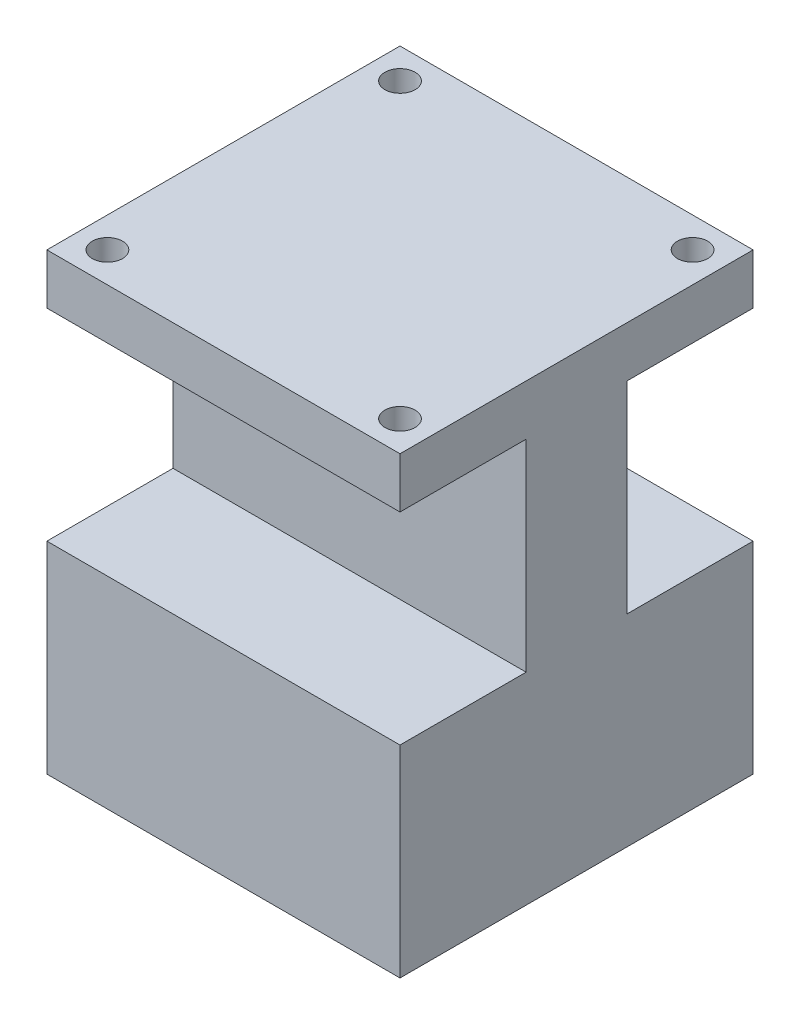
ISO-10303-21;
HEADER;
FILE_DESCRIPTION(('STEP AP214'),'2;1');
FILE_NAME('part.step','',(''),(''),'','','');
FILE_SCHEMA(('AUTOMOTIVE_DESIGN { 1 0 10303 214 1 1 1 1 }'));
ENDSEC;
DATA;
#1=APPLICATION_CONTEXT('core data for automotive mechanical design processes');
#2=APPLICATION_PROTOCOL_DEFINITION('international standard','automotive_design',2000,#1);
#3=PRODUCT_CONTEXT('',#1,'mechanical');
#4=PRODUCT('Part','Part','',(#3));
#5=PRODUCT_RELATED_PRODUCT_CATEGORY('part','',(#4));
#6=PRODUCT_DEFINITION_FORMATION('','',#4);
#7=PRODUCT_DEFINITION_CONTEXT('part definition',#1,'design');
#8=PRODUCT_DEFINITION('design','',#6,#7);
#9=PRODUCT_DEFINITION_SHAPE('','',#8);
#10=(LENGTH_UNIT() NAMED_UNIT(*) SI_UNIT(.MILLI.,.METRE.));
#11=(NAMED_UNIT(*) PLANE_ANGLE_UNIT() SI_UNIT($,.RADIAN.));
#12=(NAMED_UNIT(*) SI_UNIT($,.STERADIAN.) SOLID_ANGLE_UNIT());
#13=UNCERTAINTY_MEASURE_WITH_UNIT(LENGTH_MEASURE(1.E-05),#10,'distance_accuracy_value','');
#14=(GEOMETRIC_REPRESENTATION_CONTEXT(3) GLOBAL_UNCERTAINTY_ASSIGNED_CONTEXT((#13)) GLOBAL_UNIT_ASSIGNED_CONTEXT((#10,
#11,#12)) REPRESENTATION_CONTEXT('',''));
#15=CARTESIAN_POINT('',(0.,0.,0.));
#16=DIRECTION('',(0.,0.,1.));
#17=DIRECTION('',(1.,0.,0.));
#18=AXIS2_PLACEMENT_3D('',#15,#16,#17);
#19=CARTESIAN_POINT('',(0.,20.,0.));
#20=DIRECTION('',(0.,1.,0.));
#21=DIRECTION('',(0.,0.,1.));
#22=AXIS2_PLACEMENT_3D('',#19,#20,#21);
#23=PLANE('',#22);
#24=DIRECTION('',(1.,0.,0.));
#25=VECTOR('',#24,1.);
#26=CARTESIAN_POINT('',(-17.5,20.,5.));
#27=LINE('',#26,#25);
#28=CARTESIAN_POINT('',(-17.5,20.,5.));
#29=VERTEX_POINT('',#28);
#30=CARTESIAN_POINT('',(17.5,20.,5.));
#31=VERTEX_POINT('',#30);
#32=EDGE_CURVE('E62',#29,#31,#27,.T.);
#33=ORIENTED_EDGE('',*,*,#32,.F.);
#34=DIRECTION('',(0.,0.,1.));
#35=VECTOR('',#34,1.);
#36=CARTESIAN_POINT('',(-17.5,20.,-17.5));
#37=LINE('',#36,#35);
#38=CARTESIAN_POINT('',(-17.5,20.,17.5));
#39=VERTEX_POINT('',#38);
#40=EDGE_CURVE('E202',#29,#39,#37,.T.);
#41=ORIENTED_EDGE('',*,*,#40,.T.);
#42=DIRECTION('',(1.,0.,0.));
#43=VECTOR('',#42,1.);
#44=CARTESIAN_POINT('',(-17.5,20.,17.5));
#45=LINE('',#44,#43);
#46=CARTESIAN_POINT('',(17.5,20.,17.5));
#47=VERTEX_POINT('',#46);
#48=EDGE_CURVE('E207',#39,#47,#45,.T.);
#49=ORIENTED_EDGE('',*,*,#48,.T.);
#50=DIRECTION('',(0.,0.,-1.));
#51=VECTOR('',#50,1.);
#52=CARTESIAN_POINT('',(17.5,20.,-17.5));
#53=LINE('',#52,#51);
#54=EDGE_CURVE('E196',#47,#31,#53,.T.);
#55=ORIENTED_EDGE('',*,*,#54,.T.);
#56=EDGE_LOOP('',(#33,#41,#49,#55));
#57=FACE_BOUND('',#56,.T.);
#58=ADVANCED_FACE('F44',(#57),#23,.T.);
#59=CARTESIAN_POINT('',(17.5,20.,-17.5));
#60=DIRECTION('',(-1.,0.,0.));
#61=DIRECTION('',(0.,0.,1.));
#62=AXIS2_PLACEMENT_3D('',#59,#60,#61);
#63=PLANE('',#62);
#64=DIRECTION('',(0.,0.,-1.));
#65=VECTOR('',#64,1.);
#66=CARTESIAN_POINT('',(17.5,0.,-17.5));
#67=LINE('',#66,#65);
#68=CARTESIAN_POINT('',(17.5,0.,17.5));
#69=VERTEX_POINT('',#68);
#70=CARTESIAN_POINT('',(17.5,0.,-17.5));
#71=VERTEX_POINT('',#70);
#72=EDGE_CURVE('E197',#69,#71,#67,.T.);
#73=ORIENTED_EDGE('',*,*,#72,.T.);
#74=DIRECTION('',(0.,-1.,0.));
#75=VECTOR('',#74,1.);
#76=CARTESIAN_POINT('',(17.5,20.,-17.5));
#77=LINE('',#76,#75);
#78=CARTESIAN_POINT('',(17.5,20.,-17.5));
#79=VERTEX_POINT('',#78);
#80=EDGE_CURVE('E11',#79,#71,#77,.T.);
#81=ORIENTED_EDGE('',*,*,#80,.F.);
#82=CARTESIAN_POINT('',(17.5,20.,-5.));
#83=VERTEX_POINT('',#82);
#84=EDGE_CURVE('E205',#83,#79,#53,.T.);
#85=ORIENTED_EDGE('',*,*,#84,.F.);
#86=DIRECTION('',(0.,-1.,0.));
#87=VECTOR('',#86,1.);
#88=CARTESIAN_POINT('',(17.5,40.,-5.));
#89=LINE('',#88,#87);
#90=CARTESIAN_POINT('',(17.5,40.,-5.));
#91=VERTEX_POINT('',#90);
#92=EDGE_CURVE('E195',#91,#83,#89,.T.);
#93=ORIENTED_EDGE('',*,*,#92,.F.);
#94=DIRECTION('',(0.,0.,-1.));
#95=VECTOR('',#94,1.);
#96=CARTESIAN_POINT('',(17.5,40.,-17.5));
#97=LINE('',#96,#95);
#98=CARTESIAN_POINT('',(17.5,40.,-17.5));
#99=VERTEX_POINT('',#98);
#100=EDGE_CURVE('E460',#91,#99,#97,.T.);
#101=ORIENTED_EDGE('',*,*,#100,.T.);
#102=DIRECTION('',(0.,-1.,0.));
#103=VECTOR('',#102,1.);
#104=CARTESIAN_POINT('',(17.5,45.,-17.5));
#105=LINE('',#104,#103);
#106=CARTESIAN_POINT('',(17.5,45.,-17.5));
#107=VERTEX_POINT('',#106);
#108=EDGE_CURVE('E170',#107,#99,#105,.T.);
#109=ORIENTED_EDGE('',*,*,#108,.F.);
#110=DIRECTION('',(0.,0.,-1.));
#111=VECTOR('',#110,1.);
#112=CARTESIAN_POINT('',(17.5,45.,-17.5));
#113=LINE('',#112,#111);
#114=CARTESIAN_POINT('',(17.5,45.,17.5));
#115=VERTEX_POINT('',#114);
#116=EDGE_CURVE('E144',#115,#107,#113,.T.);
#117=ORIENTED_EDGE('',*,*,#116,.F.);
#118=DIRECTION('',(0.,-1.,0.));
#119=VECTOR('',#118,1.);
#120=CARTESIAN_POINT('',(17.5,45.,17.5));
#121=LINE('',#120,#119);
#122=CARTESIAN_POINT('',(17.5,40.,17.5));
#123=VERTEX_POINT('',#122);
#124=EDGE_CURVE('E143',#115,#123,#121,.T.);
#125=ORIENTED_EDGE('',*,*,#124,.T.);
#126=CARTESIAN_POINT('',(17.5,40.,5.));
#127=VERTEX_POINT('',#126);
#128=EDGE_CURVE('E456',#123,#127,#97,.T.);
#129=ORIENTED_EDGE('',*,*,#128,.T.);
#130=DIRECTION('',(0.,-1.,0.));
#131=VECTOR('',#130,1.);
#132=CARTESIAN_POINT('',(17.5,40.,5.));
#133=LINE('',#132,#131);
#134=EDGE_CURVE('E180',#127,#31,#133,.T.);
#135=ORIENTED_EDGE('',*,*,#134,.T.);
#136=ORIENTED_EDGE('',*,*,#54,.F.);
#137=DIRECTION('',(0.,-1.,0.));
#138=VECTOR('',#137,1.);
#139=CARTESIAN_POINT('',(17.5,20.,17.5));
#140=LINE('',#139,#138);
#141=EDGE_CURVE('E215',#47,#69,#140,.T.);
#142=ORIENTED_EDGE('',*,*,#141,.T.);
#143=EDGE_LOOP('',(#73,#81,#85,#93,#101,#109,#117,#125,#129,#135,#136,#142));
#144=FACE_BOUND('',#143,.T.);
#145=ADVANCED_FACE('F50',(#144),#63,.F.);
#146=CARTESIAN_POINT('',(-17.5,20.,-17.5));
#147=DIRECTION('',(0.,0.,1.));
#148=DIRECTION('',(1.,0.,0.));
#149=AXIS2_PLACEMENT_3D('',#146,#147,#148);
#150=PLANE('',#149);
#151=DIRECTION('',(-1.,0.,0.));
#152=VECTOR('',#151,1.);
#153=CARTESIAN_POINT('',(-17.5,0.,-17.5));
#154=LINE('',#153,#152);
#155=CARTESIAN_POINT('',(-17.5,0.,-17.5));
#156=VERTEX_POINT('',#155);
#157=EDGE_CURVE('E216',#71,#156,#154,.T.);
#158=ORIENTED_EDGE('',*,*,#157,.T.);
#159=DIRECTION('',(0.,-1.,0.));
#160=VECTOR('',#159,1.);
#161=CARTESIAN_POINT('',(-17.5,20.,-17.5));
#162=LINE('',#161,#160);
#163=CARTESIAN_POINT('',(-17.5,20.,-17.5));
#164=VERTEX_POINT('',#163);
#165=EDGE_CURVE('E53',#164,#156,#162,.T.);
#166=ORIENTED_EDGE('',*,*,#165,.F.);
#167=DIRECTION('',(-1.,0.,0.));
#168=VECTOR('',#167,1.);
#169=CARTESIAN_POINT('',(-17.5,20.,-17.5));
#170=LINE('',#169,#168);
#171=EDGE_CURVE('E203',#79,#164,#170,.T.);
#172=ORIENTED_EDGE('',*,*,#171,.F.);
#173=ORIENTED_EDGE('',*,*,#80,.T.);
#174=EDGE_LOOP('',(#158,#166,#172,#173));
#175=FACE_BOUND('',#174,.T.);
#176=ADVANCED_FACE('F256',(#175),#150,.F.);
#177=CARTESIAN_POINT('',(-17.5,20.,-17.5));
#178=DIRECTION('',(1.,0.,0.));
#179=DIRECTION('',(0.,0.,-1.));
#180=AXIS2_PLACEMENT_3D('',#177,#178,#179);
#181=PLANE('',#180);
#182=DIRECTION('',(0.,0.,1.));
#183=VECTOR('',#182,1.);
#184=CARTESIAN_POINT('',(-17.5,0.,-17.5));
#185=LINE('',#184,#183);
#186=CARTESIAN_POINT('',(-17.5,0.,17.5));
#187=VERTEX_POINT('',#186);
#188=EDGE_CURVE('E218',#156,#187,#185,.T.);
#189=ORIENTED_EDGE('',*,*,#188,.T.);
#190=DIRECTION('',(0.,-1.,0.));
#191=VECTOR('',#190,1.);
#192=CARTESIAN_POINT('',(-17.5,20.,17.5));
#193=LINE('',#192,#191);
#194=EDGE_CURVE('E229',#39,#187,#193,.T.);
#195=ORIENTED_EDGE('',*,*,#194,.F.);
#196=ORIENTED_EDGE('',*,*,#40,.F.);
#197=DIRECTION('',(0.,-1.,0.));
#198=VECTOR('',#197,1.);
#199=CARTESIAN_POINT('',(-17.5,40.,5.));
#200=LINE('',#199,#198);
#201=CARTESIAN_POINT('',(-17.5,40.,5.));
#202=VERTEX_POINT('',#201);
#203=EDGE_CURVE('E183',#202,#29,#200,.T.);
#204=ORIENTED_EDGE('',*,*,#203,.F.);
#205=DIRECTION('',(0.,0.,1.));
#206=VECTOR('',#205,1.);
#207=CARTESIAN_POINT('',(-17.5,40.,-17.5));
#208=LINE('',#207,#206);
#209=CARTESIAN_POINT('',(-17.5,40.,17.5));
#210=VERTEX_POINT('',#209);
#211=EDGE_CURVE('E159',#202,#210,#208,.T.);
#212=ORIENTED_EDGE('',*,*,#211,.T.);
#213=DIRECTION('',(0.,-1.,0.));
#214=VECTOR('',#213,1.);
#215=CARTESIAN_POINT('',(-17.5,45.,17.5));
#216=LINE('',#215,#214);
#217=CARTESIAN_POINT('',(-17.5,45.,17.5));
#218=VERTEX_POINT('',#217);
#219=EDGE_CURVE('E136',#218,#210,#216,.T.);
#220=ORIENTED_EDGE('',*,*,#219,.F.);
#221=DIRECTION('',(0.,0.,1.));
#222=VECTOR('',#221,1.);
#223=CARTESIAN_POINT('',(-17.5,45.,-17.5));
#224=LINE('',#223,#222);
#225=CARTESIAN_POINT('',(-17.5,45.,-17.5));
#226=VERTEX_POINT('',#225);
#227=EDGE_CURVE('E148',#226,#218,#224,.T.);
#228=ORIENTED_EDGE('',*,*,#227,.F.);
#229=DIRECTION('',(0.,-1.,0.));
#230=VECTOR('',#229,1.);
#231=CARTESIAN_POINT('',(-17.5,45.,-17.5));
#232=LINE('',#231,#230);
#233=CARTESIAN_POINT('',(-17.5,40.,-17.5));
#234=VERTEX_POINT('',#233);
#235=EDGE_CURVE('E446',#226,#234,#232,.T.);
#236=ORIENTED_EDGE('',*,*,#235,.T.);
#237=CARTESIAN_POINT('',(-17.5,40.,-5.));
#238=VERTEX_POINT('',#237);
#239=EDGE_CURVE('E448',#234,#238,#208,.T.);
#240=ORIENTED_EDGE('',*,*,#239,.T.);
#241=DIRECTION('',(0.,-1.,0.));
#242=VECTOR('',#241,1.);
#243=CARTESIAN_POINT('',(-17.5,40.,-5.));
#244=LINE('',#243,#242);
#245=CARTESIAN_POINT('',(-17.5,20.,-5.));
#246=VERTEX_POINT('',#245);
#247=EDGE_CURVE('E186',#238,#246,#244,.T.);
#248=ORIENTED_EDGE('',*,*,#247,.T.);
#249=EDGE_CURVE('E206',#164,#246,#37,.T.);
#250=ORIENTED_EDGE('',*,*,#249,.F.);
#251=ORIENTED_EDGE('',*,*,#165,.T.);
#252=EDGE_LOOP('',(#189,#195,#196,#204,#212,#220,#228,#236,#240,#248,#250,#251));
#253=FACE_BOUND('',#252,.T.);
#254=ADVANCED_FACE('F158',(#253),#181,.F.);
#255=CARTESIAN_POINT('',(-17.5,20.,17.5));
#256=DIRECTION('',(0.,0.,-1.));
#257=DIRECTION('',(-1.,0.,0.));
#258=AXIS2_PLACEMENT_3D('',#255,#256,#257);
#259=PLANE('',#258);
#260=DIRECTION('',(1.,0.,0.));
#261=VECTOR('',#260,1.);
#262=CARTESIAN_POINT('',(-17.5,0.,17.5));
#263=LINE('',#262,#261);
#264=EDGE_CURVE('E225',#187,#69,#263,.T.);
#265=ORIENTED_EDGE('',*,*,#264,.T.);
#266=ORIENTED_EDGE('',*,*,#141,.F.);
#267=ORIENTED_EDGE('',*,*,#48,.F.);
#268=ORIENTED_EDGE('',*,*,#194,.T.);
#269=EDGE_LOOP('',(#265,#266,#267,#268));
#270=FACE_BOUND('',#269,.T.);
#271=ADVANCED_FACE('F243',(#270),#259,.F.);
#272=DIRECTION('',(-1.,0.,0.));
#273=VECTOR('',#272,1.);
#274=CARTESIAN_POINT('',(-17.5,20.,-5.));
#275=LINE('',#274,#273);
#276=EDGE_CURVE('E66',#83,#246,#275,.T.);
#277=ORIENTED_EDGE('',*,*,#276,.F.);
#278=ORIENTED_EDGE('',*,*,#84,.T.);
#279=ORIENTED_EDGE('',*,*,#171,.T.);
#280=ORIENTED_EDGE('',*,*,#249,.T.);
#281=EDGE_LOOP('',(#277,#278,#279,#280));
#282=FACE_BOUND('',#281,.T.);
#283=ADVANCED_FACE('F258',(#282),#23,.T.);
#284=CARTESIAN_POINT('',(0.,0.,0.));
#285=DIRECTION('',(0.,1.,0.));
#286=DIRECTION('',(0.,0.,1.));
#287=AXIS2_PLACEMENT_3D('',#284,#285,#286);
#288=PLANE('',#287);
#289=ORIENTED_EDGE('',*,*,#72,.F.);
#290=ORIENTED_EDGE('',*,*,#264,.F.);
#291=ORIENTED_EDGE('',*,*,#188,.F.);
#292=ORIENTED_EDGE('',*,*,#157,.F.);
#293=EDGE_LOOP('',(#289,#290,#291,#292));
#294=FACE_BOUND('',#293,.T.);
#295=ADVANCED_FACE('F245',(#294),#288,.F.);
#296=CARTESIAN_POINT('',(-17.5,40.,-5.));
#297=DIRECTION('',(0.,0.,1.));
#298=DIRECTION('',(1.,0.,0.));
#299=AXIS2_PLACEMENT_3D('',#296,#297,#298);
#300=PLANE('',#299);
#301=ORIENTED_EDGE('',*,*,#276,.T.);
#302=ORIENTED_EDGE('',*,*,#247,.F.);
#303=DIRECTION('',(-1.,0.,0.));
#304=VECTOR('',#303,1.);
#305=CARTESIAN_POINT('',(-17.5,40.,-5.));
#306=LINE('',#305,#304);
#307=EDGE_CURVE('E172',#91,#238,#306,.T.);
#308=ORIENTED_EDGE('',*,*,#307,.F.);
#309=ORIENTED_EDGE('',*,*,#92,.T.);
#310=EDGE_LOOP('',(#301,#302,#308,#309));
#311=FACE_BOUND('',#310,.T.);
#312=ADVANCED_FACE('F277',(#311),#300,.F.);
#313=CARTESIAN_POINT('',(-17.5,40.,5.));
#314=DIRECTION('',(0.,0.,-1.));
#315=DIRECTION('',(-1.,0.,0.));
#316=AXIS2_PLACEMENT_3D('',#313,#314,#315);
#317=PLANE('',#316);
#318=ORIENTED_EDGE('',*,*,#32,.T.);
#319=ORIENTED_EDGE('',*,*,#134,.F.);
#320=DIRECTION('',(1.,0.,0.));
#321=VECTOR('',#320,1.);
#322=CARTESIAN_POINT('',(-17.5,40.,5.));
#323=LINE('',#322,#321);
#324=EDGE_CURVE('E173',#202,#127,#323,.T.);
#325=ORIENTED_EDGE('',*,*,#324,.F.);
#326=ORIENTED_EDGE('',*,*,#203,.T.);
#327=EDGE_LOOP('',(#318,#319,#325,#326));
#328=FACE_BOUND('',#327,.T.);
#329=ADVANCED_FACE('F252',(#328),#317,.F.);
#330=CARTESIAN_POINT('',(0.,40.,0.));
#331=DIRECTION('',(0.,1.,0.));
#332=DIRECTION('',(0.,0.,1.));
#333=AXIS2_PLACEMENT_3D('',#330,#331,#332);
#334=PLANE('',#333);
#335=CARTESIAN_POINT('',(14.5,40.,-14.5));
#336=DIRECTION('',(0.,1.,0.));
#337=DIRECTION('',(0.,0.,1.));
#338=AXIS2_PLACEMENT_3D('',#335,#336,#337);
#339=CIRCLE('',#338,1.5);
#340=CARTESIAN_POINT('',(14.5,40.,-13.));
#341=VERTEX_POINT('',#340);
#342=EDGE_CURVE('E442',#341,#341,#339,.F.);
#343=ORIENTED_EDGE('',*,*,#342,.F.);
#344=EDGE_LOOP('',(#343));
#345=FACE_BOUND('',#344,.T.);
#346=CARTESIAN_POINT('',(-14.5,40.,-14.5));
#347=DIRECTION('',(0.,1.,0.));
#348=DIRECTION('',(0.,0.,1.));
#349=AXIS2_PLACEMENT_3D('',#346,#347,#348);
#350=CIRCLE('',#349,1.5);
#351=CARTESIAN_POINT('',(-14.5,40.,-13.));
#352=VERTEX_POINT('',#351);
#353=EDGE_CURVE('E436',#352,#352,#350,.F.);
#354=ORIENTED_EDGE('',*,*,#353,.F.);
#355=EDGE_LOOP('',(#354));
#356=FACE_BOUND('',#355,.T.);
#357=ORIENTED_EDGE('',*,*,#100,.F.);
#358=ORIENTED_EDGE('',*,*,#307,.T.);
#359=ORIENTED_EDGE('',*,*,#239,.F.);
#360=DIRECTION('',(-1.,0.,0.));
#361=VECTOR('',#360,1.);
#362=CARTESIAN_POINT('',(-17.5,40.,-17.5));
#363=LINE('',#362,#361);
#364=EDGE_CURVE('E156',#99,#234,#363,.T.);
#365=ORIENTED_EDGE('',*,*,#364,.F.);
#366=EDGE_LOOP('',(#357,#358,#359,#365));
#367=FACE_BOUND('',#366,.T.);
#368=ADVANCED_FACE('F329',(#345,#356,#367),#334,.F.);
#369=CARTESIAN_POINT('',(-14.5,40.,14.5));
#370=DIRECTION('',(0.,1.,0.));
#371=DIRECTION('',(0.,0.,1.));
#372=AXIS2_PLACEMENT_3D('',#369,#370,#371);
#373=CIRCLE('',#372,1.5);
#374=CARTESIAN_POINT('',(-14.5,40.,16.));
#375=VERTEX_POINT('',#374);
#376=EDGE_CURVE('E424',#375,#375,#373,.F.);
#377=ORIENTED_EDGE('',*,*,#376,.F.);
#378=EDGE_LOOP('',(#377));
#379=FACE_BOUND('',#378,.T.);
#380=CARTESIAN_POINT('',(14.5,40.,14.5));
#381=DIRECTION('',(0.,1.,0.));
#382=DIRECTION('',(0.,0.,1.));
#383=AXIS2_PLACEMENT_3D('',#380,#381,#382);
#384=CIRCLE('',#383,1.5);
#385=CARTESIAN_POINT('',(14.5,40.,16.));
#386=VERTEX_POINT('',#385);
#387=EDGE_CURVE('E431',#386,#386,#384,.F.);
#388=ORIENTED_EDGE('',*,*,#387,.F.);
#389=EDGE_LOOP('',(#388));
#390=FACE_BOUND('',#389,.T.);
#391=ORIENTED_EDGE('',*,*,#211,.F.);
#392=ORIENTED_EDGE('',*,*,#324,.T.);
#393=ORIENTED_EDGE('',*,*,#128,.F.);
#394=DIRECTION('',(1.,0.,0.));
#395=VECTOR('',#394,1.);
#396=CARTESIAN_POINT('',(-17.5,40.,17.5));
#397=LINE('',#396,#395);
#398=EDGE_CURVE('E451',#210,#123,#397,.T.);
#399=ORIENTED_EDGE('',*,*,#398,.F.);
#400=EDGE_LOOP('',(#391,#392,#393,#399));
#401=FACE_BOUND('',#400,.T.);
#402=ADVANCED_FACE('F338',(#379,#390,#401),#334,.F.);
#403=CARTESIAN_POINT('',(-17.5,45.,17.5));
#404=DIRECTION('',(0.,0.,-1.));
#405=DIRECTION('',(-1.,0.,0.));
#406=AXIS2_PLACEMENT_3D('',#403,#404,#405);
#407=PLANE('',#406);
#408=ORIENTED_EDGE('',*,*,#398,.T.);
#409=ORIENTED_EDGE('',*,*,#124,.F.);
#410=DIRECTION('',(1.,0.,0.));
#411=VECTOR('',#410,1.);
#412=CARTESIAN_POINT('',(-17.5,45.,17.5));
#413=LINE('',#412,#411);
#414=EDGE_CURVE('E133',#218,#115,#413,.T.);
#415=ORIENTED_EDGE('',*,*,#414,.F.);
#416=ORIENTED_EDGE('',*,*,#219,.T.);
#417=EDGE_LOOP('',(#408,#409,#415,#416));
#418=FACE_BOUND('',#417,.T.);
#419=ADVANCED_FACE('F139',(#418),#407,.F.);
#420=CARTESIAN_POINT('',(-17.5,45.,-17.5));
#421=DIRECTION('',(0.,0.,1.));
#422=DIRECTION('',(1.,0.,0.));
#423=AXIS2_PLACEMENT_3D('',#420,#421,#422);
#424=PLANE('',#423);
#425=ORIENTED_EDGE('',*,*,#364,.T.);
#426=ORIENTED_EDGE('',*,*,#235,.F.);
#427=DIRECTION('',(-1.,0.,0.));
#428=VECTOR('',#427,1.);
#429=CARTESIAN_POINT('',(-17.5,45.,-17.5));
#430=LINE('',#429,#428);
#431=EDGE_CURVE('E151',#107,#226,#430,.T.);
#432=ORIENTED_EDGE('',*,*,#431,.F.);
#433=ORIENTED_EDGE('',*,*,#108,.T.);
#434=EDGE_LOOP('',(#425,#426,#432,#433));
#435=FACE_BOUND('',#434,.T.);
#436=ADVANCED_FACE('F336',(#435),#424,.F.);
#437=CARTESIAN_POINT('',(0.,45.,0.));
#438=DIRECTION('',(0.,1.,0.));
#439=DIRECTION('',(0.,0.,1.));
#440=AXIS2_PLACEMENT_3D('',#437,#438,#439);
#441=PLANE('',#440);
#442=CARTESIAN_POINT('',(-14.5,45.,14.5));
#443=DIRECTION('',(0.,1.,0.));
#444=DIRECTION('',(0.,0.,-1.));
#445=AXIS2_PLACEMENT_3D('',#442,#443,#444);
#446=CIRCLE('',#445,1.5);
#447=CARTESIAN_POINT('',(-14.5,45.,13.));
#448=VERTEX_POINT('',#447);
#449=EDGE_CURVE('E423',#448,#448,#446,.T.);
#450=ORIENTED_EDGE('',*,*,#449,.F.);
#451=EDGE_LOOP('',(#450));
#452=FACE_BOUND('',#451,.T.);
#453=CARTESIAN_POINT('',(14.5,45.,14.5));
#454=DIRECTION('',(0.,1.,0.));
#455=DIRECTION('',(0.,0.,1.));
#456=AXIS2_PLACEMENT_3D('',#453,#454,#455);
#457=CIRCLE('',#456,1.5);
#458=CARTESIAN_POINT('',(14.5,45.,16.));
#459=VERTEX_POINT('',#458);
#460=EDGE_CURVE('E426',#459,#459,#457,.T.);
#461=ORIENTED_EDGE('',*,*,#460,.F.);
#462=EDGE_LOOP('',(#461));
#463=FACE_BOUND('',#462,.T.);
#464=CARTESIAN_POINT('',(14.5,45.,-14.5));
#465=DIRECTION('',(0.,1.,0.));
#466=DIRECTION('',(0.,0.,-1.));
#467=AXIS2_PLACEMENT_3D('',#464,#465,#466);
#468=CIRCLE('',#467,1.5);
#469=CARTESIAN_POINT('',(14.5,45.,-16.));
#470=VERTEX_POINT('',#469);
#471=EDGE_CURVE('E478',#470,#470,#468,.T.);
#472=ORIENTED_EDGE('',*,*,#471,.F.);
#473=EDGE_LOOP('',(#472));
#474=FACE_BOUND('',#473,.T.);
#475=CARTESIAN_POINT('',(-14.5,45.,-14.5));
#476=DIRECTION('',(0.,1.,0.));
#477=DIRECTION('',(0.,0.,1.));
#478=AXIS2_PLACEMENT_3D('',#475,#476,#477);
#479=CIRCLE('',#478,1.5);
#480=CARTESIAN_POINT('',(-14.5,45.,-13.));
#481=VERTEX_POINT('',#480);
#482=EDGE_CURVE('E439',#481,#481,#479,.T.);
#483=ORIENTED_EDGE('',*,*,#482,.F.);
#484=EDGE_LOOP('',(#483));
#485=FACE_BOUND('',#484,.T.);
#486=ORIENTED_EDGE('',*,*,#227,.T.);
#487=ORIENTED_EDGE('',*,*,#414,.T.);
#488=ORIENTED_EDGE('',*,*,#116,.T.);
#489=ORIENTED_EDGE('',*,*,#431,.T.);
#490=EDGE_LOOP('',(#486,#487,#488,#489));
#491=FACE_BOUND('',#490,.T.);
#492=ADVANCED_FACE('F149',(#452,#463,#474,#485,#491),#441,.T.);
#493=CARTESIAN_POINT('',(-14.5,-0.001000000000001,-14.5));
#494=DIRECTION('',(0.,1.,0.));
#495=DIRECTION('',(0.,0.,1.));
#496=AXIS2_PLACEMENT_3D('',#493,#494,#495);
#497=CYLINDRICAL_SURFACE('',#496,1.5);
#498=ORIENTED_EDGE('',*,*,#482,.T.);
#499=EDGE_LOOP('',(#498));
#500=FACE_BOUND('',#499,.T.);
#501=ORIENTED_EDGE('',*,*,#353,.T.);
#502=EDGE_LOOP('',(#501));
#503=FACE_BOUND('',#502,.T.);
#504=ADVANCED_FACE('F369',(#500,#503),#497,.F.);
#505=CARTESIAN_POINT('',(14.5,-0.001000000000001,-14.5));
#506=DIRECTION('',(0.,1.,0.));
#507=DIRECTION('',(0.,0.,1.));
#508=AXIS2_PLACEMENT_3D('',#505,#506,#507);
#509=CYLINDRICAL_SURFACE('',#508,1.5);
#510=ORIENTED_EDGE('',*,*,#471,.T.);
#511=EDGE_LOOP('',(#510));
#512=FACE_BOUND('',#511,.T.);
#513=ORIENTED_EDGE('',*,*,#342,.T.);
#514=EDGE_LOOP('',(#513));
#515=FACE_BOUND('',#514,.T.);
#516=ADVANCED_FACE('F378',(#512,#515),#509,.F.);
#517=CARTESIAN_POINT('',(14.5,-0.001000000000001,14.5));
#518=DIRECTION('',(0.,1.,0.));
#519=DIRECTION('',(0.,0.,1.));
#520=AXIS2_PLACEMENT_3D('',#517,#518,#519);
#521=CYLINDRICAL_SURFACE('',#520,1.5);
#522=ORIENTED_EDGE('',*,*,#460,.T.);
#523=EDGE_LOOP('',(#522));
#524=FACE_BOUND('',#523,.T.);
#525=ORIENTED_EDGE('',*,*,#387,.T.);
#526=EDGE_LOOP('',(#525));
#527=FACE_BOUND('',#526,.T.);
#528=ADVANCED_FACE('F390',(#524,#527),#521,.F.);
#529=CARTESIAN_POINT('',(-14.5,-0.001000000000001,14.5));
#530=DIRECTION('',(0.,1.,0.));
#531=DIRECTION('',(0.,0.,1.));
#532=AXIS2_PLACEMENT_3D('',#529,#530,#531);
#533=CYLINDRICAL_SURFACE('',#532,1.5);
#534=ORIENTED_EDGE('',*,*,#449,.T.);
#535=EDGE_LOOP('',(#534));
#536=FACE_BOUND('',#535,.T.);
#537=ORIENTED_EDGE('',*,*,#376,.T.);
#538=EDGE_LOOP('',(#537));
#539=FACE_BOUND('',#538,.T.);
#540=ADVANCED_FACE('F397',(#536,#539),#533,.F.);
#541=CLOSED_SHELL('',(#58,#145,#176,#254,#271,#283,#295,#312,#329,#368,#402,#419,#436,#492,#504,
#516,#528,#540));
#542=MANIFOLD_SOLID_BREP('B2',#541);
#543=ADVANCED_BREP_SHAPE_REPRESENTATION('',(#18,#542),#14);
#544=SHAPE_DEFINITION_REPRESENTATION(#9,#543);
ENDSEC;
END-ISO-10303-21;
